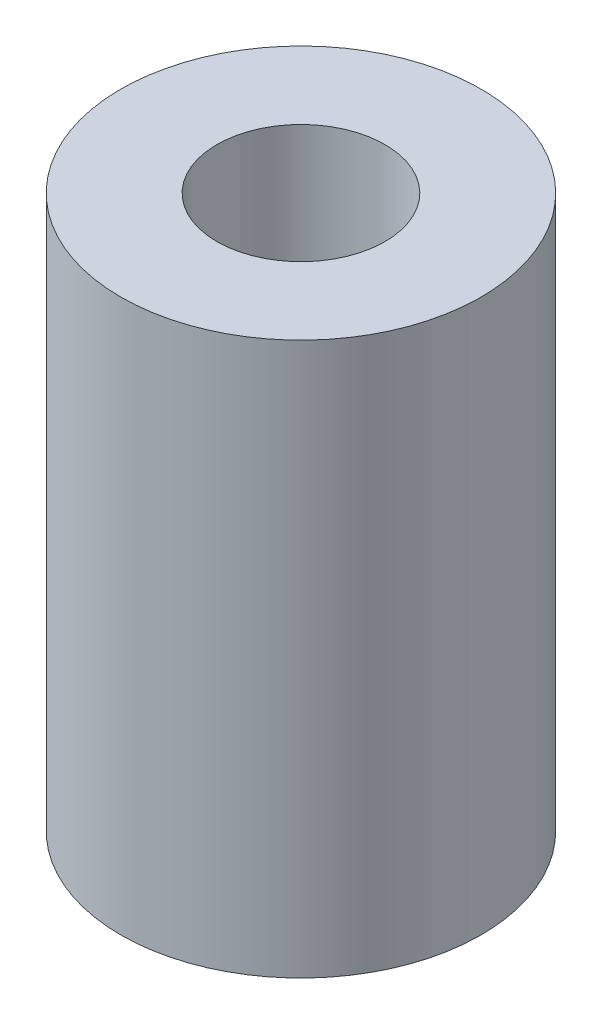
ISO-10303-21;
HEADER;
FILE_DESCRIPTION(('STEP AP214'),'2;1');
FILE_NAME('part.step','',(''),(''),'','','');
FILE_SCHEMA(('AUTOMOTIVE_DESIGN { 1 0 10303 214 1 1 1 1 }'));
ENDSEC;
DATA;
#1=APPLICATION_CONTEXT('core data for automotive mechanical design processes');
#2=APPLICATION_PROTOCOL_DEFINITION('international standard','automotive_design',2000,#1);
#3=PRODUCT_CONTEXT('',#1,'mechanical');
#4=PRODUCT('Part','Part','',(#3));
#5=PRODUCT_RELATED_PRODUCT_CATEGORY('part','',(#4));
#6=PRODUCT_DEFINITION_FORMATION('','',#4);
#7=PRODUCT_DEFINITION_CONTEXT('part definition',#1,'design');
#8=PRODUCT_DEFINITION('design','',#6,#7);
#9=PRODUCT_DEFINITION_SHAPE('','',#8);
#10=(LENGTH_UNIT() NAMED_UNIT(*) SI_UNIT(.MILLI.,.METRE.));
#11=(NAMED_UNIT(*) PLANE_ANGLE_UNIT() SI_UNIT($,.RADIAN.));
#12=(NAMED_UNIT(*) SI_UNIT($,.STERADIAN.) SOLID_ANGLE_UNIT());
#13=UNCERTAINTY_MEASURE_WITH_UNIT(LENGTH_MEASURE(1.E-05),#10,'distance_accuracy_value','');
#14=(GEOMETRIC_REPRESENTATION_CONTEXT(3) GLOBAL_UNCERTAINTY_ASSIGNED_CONTEXT((#13)) GLOBAL_UNIT_ASSIGNED_CONTEXT((#10,
#11,#12)) REPRESENTATION_CONTEXT('',''));
#15=CARTESIAN_POINT('',(0.,0.,0.));
#16=DIRECTION('',(0.,0.,1.));
#17=DIRECTION('',(1.,0.,0.));
#18=AXIS2_PLACEMENT_3D('',#15,#16,#17);
#19=CARTESIAN_POINT('',(0.,46.,0.));
#20=DIRECTION('',(0.,1.,0.));
#21=DIRECTION('',(0.,0.,1.));
#22=AXIS2_PLACEMENT_3D('',#19,#20,#21);
#23=PLANE('',#22);
#24=CARTESIAN_POINT('',(0.,46.,0.));
#25=DIRECTION('',(0.,1.,0.));
#26=DIRECTION('',(0.,0.,1.));
#27=AXIS2_PLACEMENT_3D('',#24,#25,#26);
#28=CIRCLE('',#27,15.);
#29=CARTESIAN_POINT('',(0.,46.,15.));
#30=VERTEX_POINT('',#29);
#31=EDGE_CURVE('E10',#30,#30,#28,.T.);
#32=ORIENTED_EDGE('',*,*,#31,.T.);
#33=EDGE_LOOP('',(#32));
#34=FACE_BOUND('',#33,.T.);
#35=CARTESIAN_POINT('',(0.,46.,0.));
#36=DIRECTION('',(0.,1.,0.));
#37=DIRECTION('',(0.,0.,1.));
#38=AXIS2_PLACEMENT_3D('',#35,#36,#37);
#39=CIRCLE('',#38,7.);
#40=CARTESIAN_POINT('',(0.,46.,7.00000000000001));
#41=VERTEX_POINT('',#40);
#42=EDGE_CURVE('E46',#41,#41,#39,.T.);
#43=ORIENTED_EDGE('',*,*,#42,.F.);
#44=EDGE_LOOP('',(#43));
#45=FACE_BOUND('',#44,.T.);
#46=ADVANCED_FACE('F34',(#34,#45),#23,.T.);
#47=CARTESIAN_POINT('',(0.,0.,0.));
#48=DIRECTION('',(0.,1.,0.));
#49=DIRECTION('',(0.,0.,1.));
#50=AXIS2_PLACEMENT_3D('',#47,#48,#49);
#51=PLANE('',#50);
#52=CARTESIAN_POINT('',(0.,0.,0.));
#53=DIRECTION('',(0.,1.,0.));
#54=DIRECTION('',(0.,0.,1.));
#55=AXIS2_PLACEMENT_3D('',#52,#53,#54);
#56=CIRCLE('',#55,15.);
#57=CARTESIAN_POINT('',(0.,0.,15.));
#58=VERTEX_POINT('',#57);
#59=EDGE_CURVE('E39',#58,#58,#56,.T.);
#60=ORIENTED_EDGE('',*,*,#59,.F.);
#61=EDGE_LOOP('',(#60));
#62=FACE_BOUND('',#61,.T.);
#63=CARTESIAN_POINT('',(0.,0.,0.));
#64=DIRECTION('',(0.,1.,0.));
#65=DIRECTION('',(0.,0.,1.));
#66=AXIS2_PLACEMENT_3D('',#63,#64,#65);
#67=CIRCLE('',#66,7.);
#68=CARTESIAN_POINT('',(0.,0.,7.00000000000001));
#69=VERTEX_POINT('',#68);
#70=EDGE_CURVE('E48',#69,#69,#67,.T.);
#71=ORIENTED_EDGE('',*,*,#70,.T.);
#72=EDGE_LOOP('',(#71));
#73=FACE_BOUND('',#72,.T.);
#74=ADVANCED_FACE('F59',(#62,#73),#51,.F.);
#75=CARTESIAN_POINT('',(0.,46.,0.));
#76=DIRECTION('',(0.,-1.,0.));
#77=DIRECTION('',(0.,0.,-1.));
#78=AXIS2_PLACEMENT_3D('',#75,#76,#77);
#79=CYLINDRICAL_SURFACE('',#78,15.);
#80=ORIENTED_EDGE('',*,*,#31,.F.);
#81=EDGE_LOOP('',(#80));
#82=FACE_BOUND('',#81,.T.);
#83=ORIENTED_EDGE('',*,*,#59,.T.);
#84=EDGE_LOOP('',(#83));
#85=FACE_BOUND('',#84,.T.);
#86=ADVANCED_FACE('F40',(#82,#85),#79,.T.);
#87=CARTESIAN_POINT('',(0.,46.,0.));
#88=DIRECTION('',(0.,-1.,0.));
#89=DIRECTION('',(0.,0.,-1.));
#90=AXIS2_PLACEMENT_3D('',#87,#88,#89);
#91=CYLINDRICAL_SURFACE('',#90,7.);
#92=ORIENTED_EDGE('',*,*,#42,.T.);
#93=EDGE_LOOP('',(#92));
#94=FACE_BOUND('',#93,.T.);
#95=ORIENTED_EDGE('',*,*,#70,.F.);
#96=EDGE_LOOP('',(#95));
#97=FACE_BOUND('',#96,.T.);
#98=ADVANCED_FACE('F53',(#94,#97),#91,.F.);
#99=CLOSED_SHELL('',(#46,#74,#86,#98));
#100=MANIFOLD_SOLID_BREP('B2',#99);
#101=ADVANCED_BREP_SHAPE_REPRESENTATION('',(#18,#100),#14);
#102=SHAPE_DEFINITION_REPRESENTATION(#9,#101);
ENDSEC;
END-ISO-10303-21;
